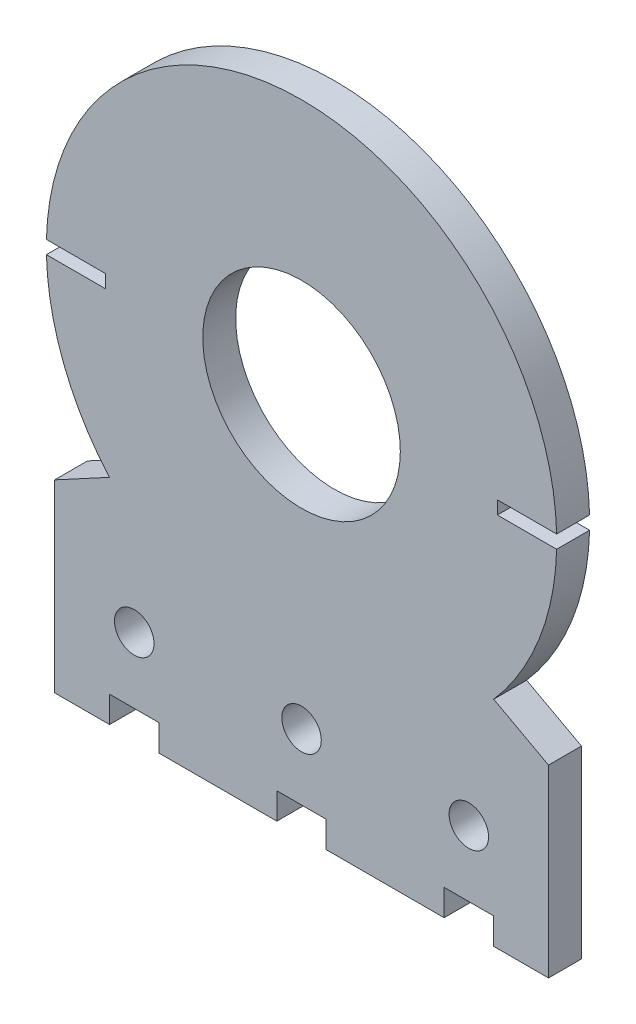
ISO-10303-21;
HEADER;
FILE_DESCRIPTION(('STEP AP214'),'2;1');
FILE_NAME('part.step','',(''),(''),'','','');
FILE_SCHEMA(('AUTOMOTIVE_DESIGN { 1 0 10303 214 1 1 1 1 }'));
ENDSEC;
DATA;
#1=APPLICATION_CONTEXT('core data for automotive mechanical design processes');
#2=APPLICATION_PROTOCOL_DEFINITION('international standard','automotive_design',2000,#1);
#3=PRODUCT_CONTEXT('',#1,'mechanical');
#4=PRODUCT('Part','Part','',(#3));
#5=PRODUCT_RELATED_PRODUCT_CATEGORY('part','',(#4));
#6=PRODUCT_DEFINITION_FORMATION('','',#4);
#7=PRODUCT_DEFINITION_CONTEXT('part definition',#1,'design');
#8=PRODUCT_DEFINITION('design','',#6,#7);
#9=PRODUCT_DEFINITION_SHAPE('','',#8);
#10=(LENGTH_UNIT() NAMED_UNIT(*) SI_UNIT(.MILLI.,.METRE.));
#11=(NAMED_UNIT(*) PLANE_ANGLE_UNIT() SI_UNIT($,.RADIAN.));
#12=(NAMED_UNIT(*) SI_UNIT($,.STERADIAN.) SOLID_ANGLE_UNIT());
#13=UNCERTAINTY_MEASURE_WITH_UNIT(LENGTH_MEASURE(1.E-05),#10,'distance_accuracy_value','');
#14=(GEOMETRIC_REPRESENTATION_CONTEXT(3) GLOBAL_UNCERTAINTY_ASSIGNED_CONTEXT((#13)) GLOBAL_UNIT_ASSIGNED_CONTEXT((#10,
#11,#12)) REPRESENTATION_CONTEXT('',''));
#15=CARTESIAN_POINT('',(0.,0.,0.));
#16=DIRECTION('',(0.,0.,1.));
#17=DIRECTION('',(1.,0.,0.));
#18=AXIS2_PLACEMENT_3D('',#15,#16,#17);
#19=CARTESIAN_POINT('',(0.,0.,0.5));
#20=DIRECTION('',(0.,0.,1.));
#21=DIRECTION('',(1.,0.,0.));
#22=AXIS2_PLACEMENT_3D('',#19,#20,#21);
#23=PLANE('',#22);
#24=CARTESIAN_POINT('',(-5.08,-8.8,0.5));
#25=DIRECTION('',(0.,0.,1.));
#26=DIRECTION('',(1.,0.,0.));
#27=AXIS2_PLACEMENT_3D('',#24,#25,#26);
#28=CIRCLE('',#27,0.6);
#29=CARTESIAN_POINT('',(-4.48,-8.8,0.5));
#30=VERTEX_POINT('',#29);
#31=EDGE_CURVE('E477',#30,#30,#28,.T.);
#32=ORIENTED_EDGE('',*,*,#31,.F.);
#33=EDGE_LOOP('',(#32));
#34=FACE_BOUND('',#33,.T.);
#35=CARTESIAN_POINT('',(0.,-8.8,0.5));
#36=DIRECTION('',(0.,0.,1.));
#37=DIRECTION('',(1.,0.,0.));
#38=AXIS2_PLACEMENT_3D('',#35,#36,#37);
#39=CIRCLE('',#38,0.6);
#40=CARTESIAN_POINT('',(0.6,-8.8,0.5));
#41=VERTEX_POINT('',#40);
#42=EDGE_CURVE('E245',#41,#41,#39,.T.);
#43=ORIENTED_EDGE('',*,*,#42,.F.);
#44=EDGE_LOOP('',(#43));
#45=FACE_BOUND('',#44,.T.);
#46=DIRECTION('',(0.,-1.,0.));
#47=VECTOR('',#46,1.);
#48=CARTESIAN_POINT('',(-7.5,-6.,0.5));
#49=LINE('',#48,#47);
#50=CARTESIAN_POINT('',(-7.5,-6.,0.5));
#51=VERTEX_POINT('',#50);
#52=CARTESIAN_POINT('',(-7.5,-11.6,0.5));
#53=VERTEX_POINT('',#52);
#54=EDGE_CURVE('E294',#51,#53,#49,.T.);
#55=ORIENTED_EDGE('',*,*,#54,.T.);
#56=DIRECTION('',(1.,0.,0.));
#57=VECTOR('',#56,1.);
#58=CARTESIAN_POINT('',(-7.5,-11.6,0.5));
#59=LINE('',#58,#57);
#60=CARTESIAN_POINT('',(-5.83,-11.6,0.5));
#61=VERTEX_POINT('',#60);
#62=EDGE_CURVE('E150',#53,#61,#59,.T.);
#63=ORIENTED_EDGE('',*,*,#62,.T.);
#64=DIRECTION('',(0.,1.,0.));
#65=VECTOR('',#64,1.);
#66=CARTESIAN_POINT('',(-5.83,-11.6,0.5));
#67=LINE('',#66,#65);
#68=CARTESIAN_POINT('',(-5.83,-10.8,0.5));
#69=VERTEX_POINT('',#68);
#70=EDGE_CURVE('E363',#61,#69,#67,.T.);
#71=ORIENTED_EDGE('',*,*,#70,.T.);
#72=DIRECTION('',(1.,0.,0.));
#73=VECTOR('',#72,1.);
#74=CARTESIAN_POINT('',(-5.83,-10.8,0.5));
#75=LINE('',#74,#73);
#76=CARTESIAN_POINT('',(-4.33,-10.8,0.5));
#77=VERTEX_POINT('',#76);
#78=EDGE_CURVE('E382',#69,#77,#75,.T.);
#79=ORIENTED_EDGE('',*,*,#78,.T.);
#80=DIRECTION('',(0.,-1.,0.));
#81=VECTOR('',#80,1.);
#82=CARTESIAN_POINT('',(-4.33,-11.6,0.5));
#83=LINE('',#82,#81);
#84=CARTESIAN_POINT('',(-4.33,-11.6,0.5));
#85=VERTEX_POINT('',#84);
#86=EDGE_CURVE('E379',#77,#85,#83,.T.);
#87=ORIENTED_EDGE('',*,*,#86,.T.);
#88=DIRECTION('',(1.,0.,0.));
#89=VECTOR('',#88,1.);
#90=CARTESIAN_POINT('',(-4.33,-11.6,0.5));
#91=LINE('',#90,#89);
#92=CARTESIAN_POINT('',(-0.75,-11.6,0.5));
#93=VERTEX_POINT('',#92);
#94=EDGE_CURVE('E381',#85,#93,#91,.T.);
#95=ORIENTED_EDGE('',*,*,#94,.T.);
#96=DIRECTION('',(0.,1.,0.));
#97=VECTOR('',#96,1.);
#98=CARTESIAN_POINT('',(-0.75,-11.6,0.5));
#99=LINE('',#98,#97);
#100=CARTESIAN_POINT('',(-0.75,-10.8,0.5));
#101=VERTEX_POINT('',#100);
#102=EDGE_CURVE('E384',#93,#101,#99,.T.);
#103=ORIENTED_EDGE('',*,*,#102,.T.);
#104=DIRECTION('',(1.,0.,0.));
#105=VECTOR('',#104,1.);
#106=CARTESIAN_POINT('',(-0.75,-10.8,0.5));
#107=LINE('',#106,#105);
#108=CARTESIAN_POINT('',(0.75,-10.8,0.5));
#109=VERTEX_POINT('',#108);
#110=EDGE_CURVE('E390',#101,#109,#107,.T.);
#111=ORIENTED_EDGE('',*,*,#110,.T.);
#112=DIRECTION('',(0.,-1.,0.));
#113=VECTOR('',#112,1.);
#114=CARTESIAN_POINT('',(0.75,-11.6,0.5));
#115=LINE('',#114,#113);
#116=CARTESIAN_POINT('',(0.75,-11.6,0.5));
#117=VERTEX_POINT('',#116);
#118=EDGE_CURVE('E392',#109,#117,#115,.T.);
#119=ORIENTED_EDGE('',*,*,#118,.T.);
#120=DIRECTION('',(1.,0.,0.));
#121=VECTOR('',#120,1.);
#122=CARTESIAN_POINT('',(0.75,-11.6,0.5));
#123=LINE('',#122,#121);
#124=CARTESIAN_POINT('',(4.33,-11.6,0.5));
#125=VERTEX_POINT('',#124);
#126=EDGE_CURVE('E394',#117,#125,#123,.T.);
#127=ORIENTED_EDGE('',*,*,#126,.T.);
#128=DIRECTION('',(0.,1.,0.));
#129=VECTOR('',#128,1.);
#130=CARTESIAN_POINT('',(4.33,-11.6,0.5));
#131=LINE('',#130,#129);
#132=CARTESIAN_POINT('',(4.33,-10.8,0.5));
#133=VERTEX_POINT('',#132);
#134=EDGE_CURVE('E396',#125,#133,#131,.T.);
#135=ORIENTED_EDGE('',*,*,#134,.T.);
#136=DIRECTION('',(1.,0.,0.));
#137=VECTOR('',#136,1.);
#138=CARTESIAN_POINT('',(4.33,-10.8,0.5));
#139=LINE('',#138,#137);
#140=CARTESIAN_POINT('',(5.83,-10.8,0.5));
#141=VERTEX_POINT('',#140);
#142=EDGE_CURVE('E398',#133,#141,#139,.T.);
#143=ORIENTED_EDGE('',*,*,#142,.T.);
#144=DIRECTION('',(0.,-1.,0.));
#145=VECTOR('',#144,1.);
#146=CARTESIAN_POINT('',(5.83,-11.6,0.5));
#147=LINE('',#146,#145);
#148=CARTESIAN_POINT('',(5.83,-11.6,0.5));
#149=VERTEX_POINT('',#148);
#150=EDGE_CURVE('E400',#141,#149,#147,.T.);
#151=ORIENTED_EDGE('',*,*,#150,.T.);
#152=DIRECTION('',(1.,0.,0.));
#153=VECTOR('',#152,1.);
#154=CARTESIAN_POINT('',(5.83,-11.6,0.5));
#155=LINE('',#154,#153);
#156=CARTESIAN_POINT('',(7.5,-11.6,0.5));
#157=VERTEX_POINT('',#156);
#158=EDGE_CURVE('E402',#149,#157,#155,.T.);
#159=ORIENTED_EDGE('',*,*,#158,.T.);
#160=DIRECTION('',(0.,1.,0.));
#161=VECTOR('',#160,1.);
#162=CARTESIAN_POINT('',(7.5,-6.,0.5));
#163=LINE('',#162,#161);
#164=CARTESIAN_POINT('',(7.5,-6.,0.5));
#165=VERTEX_POINT('',#164);
#166=EDGE_CURVE('E404',#157,#165,#163,.T.);
#167=ORIENTED_EDGE('',*,*,#166,.T.);
#168=DIRECTION('',(-0.879652496958292,0.475616951542985,0.));
#169=VECTOR('',#168,1.);
#170=CARTESIAN_POINT('',(7.5,-6.,0.5));
#171=LINE('',#170,#169);
#172=CARTESIAN_POINT('',(5.83545199620389,-5.1,0.5));
#173=VERTEX_POINT('',#172);
#174=EDGE_CURVE('E406',#165,#173,#171,.T.);
#175=ORIENTED_EDGE('',*,*,#174,.T.);
#176=CARTESIAN_POINT('',(0.,0.,0.5));
#177=DIRECTION('',(0.,0.,1.));
#178=DIRECTION('',(1.,0.,0.));
#179=AXIS2_PLACEMENT_3D('',#176,#177,#178);
#180=CIRCLE('',#179,7.75);
#181=CARTESIAN_POINT('',(7.74741892503561,-0.200000000000004,0.5));
#182=VERTEX_POINT('',#181);
#183=EDGE_CURVE('E408',#173,#182,#180,.T.);
#184=ORIENTED_EDGE('',*,*,#183,.T.);
#185=DIRECTION('',(-1.,0.,0.));
#186=VECTOR('',#185,1.);
#187=CARTESIAN_POINT('',(5.94741892503562,-0.200000000000004,0.5));
#188=LINE('',#187,#186);
#189=CARTESIAN_POINT('',(5.94741892503562,-0.200000000000004,0.5));
#190=VERTEX_POINT('',#189);
#191=EDGE_CURVE('E410',#182,#190,#188,.T.);
#192=ORIENTED_EDGE('',*,*,#191,.T.);
#193=DIRECTION('',(0.,1.,0.));
#194=VECTOR('',#193,1.);
#195=CARTESIAN_POINT('',(5.94741892503562,0.,0.5));
#196=LINE('',#195,#194);
#197=CARTESIAN_POINT('',(5.94741892503562,0.2,0.5));
#198=VERTEX_POINT('',#197);
#199=EDGE_CURVE('E412',#190,#198,#196,.T.);
#200=ORIENTED_EDGE('',*,*,#199,.T.);
#201=DIRECTION('',(1.,0.,0.));
#202=VECTOR('',#201,1.);
#203=CARTESIAN_POINT('',(5.94741892503562,0.2,0.5));
#204=LINE('',#203,#202);
#205=CARTESIAN_POINT('',(7.74741892503561,0.2,0.5));
#206=VERTEX_POINT('',#205);
#207=EDGE_CURVE('E414',#198,#206,#204,.T.);
#208=ORIENTED_EDGE('',*,*,#207,.T.);
#209=CARTESIAN_POINT('',(0.,0.,0.5));
#210=DIRECTION('',(0.,0.,1.));
#211=DIRECTION('',(1.,0.,0.));
#212=AXIS2_PLACEMENT_3D('',#209,#210,#211);
#213=CIRCLE('',#212,7.75);
#214=CARTESIAN_POINT('',(-7.74741892503561,0.2,0.5));
#215=VERTEX_POINT('',#214);
#216=EDGE_CURVE('E416',#206,#215,#213,.T.);
#217=ORIENTED_EDGE('',*,*,#216,.T.);
#218=DIRECTION('',(1.,0.,0.));
#219=VECTOR('',#218,1.);
#220=CARTESIAN_POINT('',(-5.94741892503562,0.2,0.5));
#221=LINE('',#220,#219);
#222=CARTESIAN_POINT('',(-5.94741892503562,0.2,0.5));
#223=VERTEX_POINT('',#222);
#224=EDGE_CURVE('E418',#215,#223,#221,.T.);
#225=ORIENTED_EDGE('',*,*,#224,.T.);
#226=DIRECTION('',(0.,-1.,0.));
#227=VECTOR('',#226,1.);
#228=CARTESIAN_POINT('',(-5.94741892503562,0.,0.5));
#229=LINE('',#228,#227);
#230=CARTESIAN_POINT('',(-5.94741892503562,-0.200000000000004,0.5));
#231=VERTEX_POINT('',#230);
#232=EDGE_CURVE('E223',#223,#231,#229,.T.);
#233=ORIENTED_EDGE('',*,*,#232,.T.);
#234=DIRECTION('',(-1.,0.,0.));
#235=VECTOR('',#234,1.);
#236=CARTESIAN_POINT('',(-5.94741892503562,-0.200000000000004,0.5));
#237=LINE('',#236,#235);
#238=CARTESIAN_POINT('',(-7.74741892503561,-0.200000000000004,0.5));
#239=VERTEX_POINT('',#238);
#240=EDGE_CURVE('E217',#231,#239,#237,.T.);
#241=ORIENTED_EDGE('',*,*,#240,.T.);
#242=CARTESIAN_POINT('',(0.,0.,0.5));
#243=DIRECTION('',(0.,0.,1.));
#244=DIRECTION('',(1.,0.,0.));
#245=AXIS2_PLACEMENT_3D('',#242,#243,#244);
#246=CIRCLE('',#245,7.75);
#247=CARTESIAN_POINT('',(-5.83545199620389,-5.1,0.5));
#248=VERTEX_POINT('',#247);
#249=EDGE_CURVE('E221',#239,#248,#246,.T.);
#250=ORIENTED_EDGE('',*,*,#249,.T.);
#251=DIRECTION('',(-0.879652496958292,-0.475616951542985,0.));
#252=VECTOR('',#251,1.);
#253=CARTESIAN_POINT('',(-7.5,-6.,0.5));
#254=LINE('',#253,#252);
#255=EDGE_CURVE('E53',#248,#51,#254,.T.);
#256=ORIENTED_EDGE('',*,*,#255,.T.);
#257=EDGE_LOOP('',(#55,#63,#71,#79,#87,#95,#103,#111,#119,#127,#135,#143,#151,#159,#167,#175,
#184,#192,#200,#208,#217,#225,#233,#241,#250,#256));
#258=FACE_BOUND('',#257,.T.);
#259=CARTESIAN_POINT('',(5.08,-8.8,0.5));
#260=DIRECTION('',(0.,0.,1.));
#261=DIRECTION('',(1.,0.,0.));
#262=AXIS2_PLACEMENT_3D('',#259,#260,#261);
#263=CIRCLE('',#262,0.6);
#264=CARTESIAN_POINT('',(5.68,-8.8,0.5));
#265=VERTEX_POINT('',#264);
#266=EDGE_CURVE('E483',#265,#265,#263,.T.);
#267=ORIENTED_EDGE('',*,*,#266,.F.);
#268=EDGE_LOOP('',(#267));
#269=FACE_BOUND('',#268,.T.);
#270=CARTESIAN_POINT('',(0.,0.,0.5));
#271=DIRECTION('',(0.,0.,1.));
#272=DIRECTION('',(1.,0.,0.));
#273=AXIS2_PLACEMENT_3D('',#270,#271,#272);
#274=CIRCLE('',#273,3.);
#275=CARTESIAN_POINT('',(3.,0.,0.5));
#276=VERTEX_POINT('',#275);
#277=EDGE_CURVE('E468',#276,#276,#274,.T.);
#278=ORIENTED_EDGE('',*,*,#277,.F.);
#279=EDGE_LOOP('',(#278));
#280=FACE_BOUND('',#279,.T.);
#281=ADVANCED_FACE('F36',(#34,#45,#258,#269,#280),#23,.T.);
#282=CARTESIAN_POINT('',(0.,0.,-0.5));
#283=DIRECTION('',(0.,0.,1.));
#284=DIRECTION('',(1.,0.,0.));
#285=AXIS2_PLACEMENT_3D('',#282,#283,#284);
#286=PLANE('',#285);
#287=DIRECTION('',(0.,-1.,0.));
#288=VECTOR('',#287,1.);
#289=CARTESIAN_POINT('',(-7.5,-6.,-0.5));
#290=LINE('',#289,#288);
#291=CARTESIAN_POINT('',(-7.5,-6.,-0.5));
#292=VERTEX_POINT('',#291);
#293=CARTESIAN_POINT('',(-7.5,-11.6,-0.5));
#294=VERTEX_POINT('',#293);
#295=EDGE_CURVE('E241',#292,#294,#290,.T.);
#296=ORIENTED_EDGE('',*,*,#295,.F.);
#297=DIRECTION('',(-0.879652496958292,-0.475616951542985,0.));
#298=VECTOR('',#297,1.);
#299=CARTESIAN_POINT('',(-7.5,-6.,-0.5));
#300=LINE('',#299,#298);
#301=CARTESIAN_POINT('',(-5.83545199620389,-5.1,-0.5));
#302=VERTEX_POINT('',#301);
#303=EDGE_CURVE('E142',#302,#292,#300,.T.);
#304=ORIENTED_EDGE('',*,*,#303,.F.);
#305=CARTESIAN_POINT('',(0.,0.,-0.5));
#306=DIRECTION('',(0.,0.,1.));
#307=DIRECTION('',(1.,0.,0.));
#308=AXIS2_PLACEMENT_3D('',#305,#306,#307);
#309=CIRCLE('',#308,7.75);
#310=CARTESIAN_POINT('',(-7.74741892503561,-0.200000000000004,-0.5));
#311=VERTEX_POINT('',#310);
#312=EDGE_CURVE('E136',#311,#302,#309,.T.);
#313=ORIENTED_EDGE('',*,*,#312,.F.);
#314=DIRECTION('',(-1.,0.,0.));
#315=VECTOR('',#314,1.);
#316=CARTESIAN_POINT('',(-5.94741892503562,-0.200000000000004,-0.5));
#317=LINE('',#316,#315);
#318=CARTESIAN_POINT('',(-5.94741892503562,-0.200000000000004,-0.5));
#319=VERTEX_POINT('',#318);
#320=EDGE_CURVE('E231',#319,#311,#317,.T.);
#321=ORIENTED_EDGE('',*,*,#320,.F.);
#322=DIRECTION('',(0.,-1.,0.));
#323=VECTOR('',#322,1.);
#324=CARTESIAN_POINT('',(-5.94741892503562,0.,-0.5));
#325=LINE('',#324,#323);
#326=CARTESIAN_POINT('',(-5.94741892503562,0.2,-0.5));
#327=VERTEX_POINT('',#326);
#328=EDGE_CURVE('E289',#327,#319,#325,.T.);
#329=ORIENTED_EDGE('',*,*,#328,.F.);
#330=DIRECTION('',(1.,0.,0.));
#331=VECTOR('',#330,1.);
#332=CARTESIAN_POINT('',(-5.94741892503562,0.2,-0.5));
#333=LINE('',#332,#331);
#334=CARTESIAN_POINT('',(-7.74741892503561,0.2,-0.5));
#335=VERTEX_POINT('',#334);
#336=EDGE_CURVE('E286',#335,#327,#333,.T.);
#337=ORIENTED_EDGE('',*,*,#336,.F.);
#338=CARTESIAN_POINT('',(0.,0.,-0.5));
#339=DIRECTION('',(0.,0.,1.));
#340=DIRECTION('',(1.,0.,0.));
#341=AXIS2_PLACEMENT_3D('',#338,#339,#340);
#342=CIRCLE('',#341,7.75);
#343=CARTESIAN_POINT('',(7.74741892503561,0.2,-0.5));
#344=VERTEX_POINT('',#343);
#345=EDGE_CURVE('E284',#344,#335,#342,.T.);
#346=ORIENTED_EDGE('',*,*,#345,.F.);
#347=DIRECTION('',(1.,0.,0.));
#348=VECTOR('',#347,1.);
#349=CARTESIAN_POINT('',(5.94741892503562,0.2,-0.5));
#350=LINE('',#349,#348);
#351=CARTESIAN_POINT('',(5.94741892503562,0.2,-0.5));
#352=VERTEX_POINT('',#351);
#353=EDGE_CURVE('E282',#352,#344,#350,.T.);
#354=ORIENTED_EDGE('',*,*,#353,.F.);
#355=DIRECTION('',(0.,1.,0.));
#356=VECTOR('',#355,1.);
#357=CARTESIAN_POINT('',(5.94741892503562,0.,-0.5));
#358=LINE('',#357,#356);
#359=CARTESIAN_POINT('',(5.94741892503562,-0.200000000000004,-0.5));
#360=VERTEX_POINT('',#359);
#361=EDGE_CURVE('E280',#360,#352,#358,.T.);
#362=ORIENTED_EDGE('',*,*,#361,.F.);
#363=DIRECTION('',(-1.,0.,0.));
#364=VECTOR('',#363,1.);
#365=CARTESIAN_POINT('',(5.94741892503562,-0.200000000000004,-0.5));
#366=LINE('',#365,#364);
#367=CARTESIAN_POINT('',(7.74741892503561,-0.200000000000004,-0.5));
#368=VERTEX_POINT('',#367);
#369=EDGE_CURVE('E277',#368,#360,#366,.T.);
#370=ORIENTED_EDGE('',*,*,#369,.F.);
#371=CARTESIAN_POINT('',(0.,0.,-0.5));
#372=DIRECTION('',(0.,0.,1.));
#373=DIRECTION('',(1.,0.,0.));
#374=AXIS2_PLACEMENT_3D('',#371,#372,#373);
#375=CIRCLE('',#374,7.75);
#376=CARTESIAN_POINT('',(5.83545199620389,-5.1,-0.5));
#377=VERTEX_POINT('',#376);
#378=EDGE_CURVE('E275',#377,#368,#375,.T.);
#379=ORIENTED_EDGE('',*,*,#378,.F.);
#380=DIRECTION('',(-0.879652496958292,0.475616951542985,0.));
#381=VECTOR('',#380,1.);
#382=CARTESIAN_POINT('',(7.5,-6.,-0.5));
#383=LINE('',#382,#381);
#384=CARTESIAN_POINT('',(7.5,-6.,-0.5));
#385=VERTEX_POINT('',#384);
#386=EDGE_CURVE('E273',#385,#377,#383,.T.);
#387=ORIENTED_EDGE('',*,*,#386,.F.);
#388=DIRECTION('',(0.,1.,0.));
#389=VECTOR('',#388,1.);
#390=CARTESIAN_POINT('',(7.5,-6.,-0.5));
#391=LINE('',#390,#389);
#392=CARTESIAN_POINT('',(7.5,-11.6,-0.5));
#393=VERTEX_POINT('',#392);
#394=EDGE_CURVE('E271',#393,#385,#391,.T.);
#395=ORIENTED_EDGE('',*,*,#394,.F.);
#396=DIRECTION('',(1.,0.,0.));
#397=VECTOR('',#396,1.);
#398=CARTESIAN_POINT('',(5.83,-11.6,-0.5));
#399=LINE('',#398,#397);
#400=CARTESIAN_POINT('',(5.83,-11.6,-0.5));
#401=VERTEX_POINT('',#400);
#402=EDGE_CURVE('E269',#401,#393,#399,.T.);
#403=ORIENTED_EDGE('',*,*,#402,.F.);
#404=DIRECTION('',(0.,-1.,0.));
#405=VECTOR('',#404,1.);
#406=CARTESIAN_POINT('',(5.83,-11.6,-0.5));
#407=LINE('',#406,#405);
#408=CARTESIAN_POINT('',(5.83,-10.8,-0.5));
#409=VERTEX_POINT('',#408);
#410=EDGE_CURVE('E267',#409,#401,#407,.T.);
#411=ORIENTED_EDGE('',*,*,#410,.F.);
#412=DIRECTION('',(1.,0.,0.));
#413=VECTOR('',#412,1.);
#414=CARTESIAN_POINT('',(4.33,-10.8,-0.5));
#415=LINE('',#414,#413);
#416=CARTESIAN_POINT('',(4.33,-10.8,-0.5));
#417=VERTEX_POINT('',#416);
#418=EDGE_CURVE('E265',#417,#409,#415,.T.);
#419=ORIENTED_EDGE('',*,*,#418,.F.);
#420=DIRECTION('',(0.,1.,0.));
#421=VECTOR('',#420,1.);
#422=CARTESIAN_POINT('',(4.33,-11.6,-0.5));
#423=LINE('',#422,#421);
#424=CARTESIAN_POINT('',(4.33,-11.6,-0.5));
#425=VERTEX_POINT('',#424);
#426=EDGE_CURVE('E263',#425,#417,#423,.T.);
#427=ORIENTED_EDGE('',*,*,#426,.F.);
#428=DIRECTION('',(1.,0.,0.));
#429=VECTOR('',#428,1.);
#430=CARTESIAN_POINT('',(0.75,-11.6,-0.5));
#431=LINE('',#430,#429);
#432=CARTESIAN_POINT('',(0.75,-11.6,-0.5));
#433=VERTEX_POINT('',#432);
#434=EDGE_CURVE('E261',#433,#425,#431,.T.);
#435=ORIENTED_EDGE('',*,*,#434,.F.);
#436=DIRECTION('',(0.,-1.,0.));
#437=VECTOR('',#436,1.);
#438=CARTESIAN_POINT('',(0.75,-11.6,-0.5));
#439=LINE('',#438,#437);
#440=CARTESIAN_POINT('',(0.75,-10.8,-0.5));
#441=VERTEX_POINT('',#440);
#442=EDGE_CURVE('E259',#441,#433,#439,.T.);
#443=ORIENTED_EDGE('',*,*,#442,.F.);
#444=DIRECTION('',(1.,0.,0.));
#445=VECTOR('',#444,1.);
#446=CARTESIAN_POINT('',(-0.75,-10.8,-0.5));
#447=LINE('',#446,#445);
#448=CARTESIAN_POINT('',(-0.75,-10.8,-0.5));
#449=VERTEX_POINT('',#448);
#450=EDGE_CURVE('E257',#449,#441,#447,.T.);
#451=ORIENTED_EDGE('',*,*,#450,.F.);
#452=DIRECTION('',(0.,1.,0.));
#453=VECTOR('',#452,1.);
#454=CARTESIAN_POINT('',(-0.75,-11.6,-0.5));
#455=LINE('',#454,#453);
#456=CARTESIAN_POINT('',(-0.75,-11.6,-0.5));
#457=VERTEX_POINT('',#456);
#458=EDGE_CURVE('E255',#457,#449,#455,.T.);
#459=ORIENTED_EDGE('',*,*,#458,.F.);
#460=DIRECTION('',(1.,0.,0.));
#461=VECTOR('',#460,1.);
#462=CARTESIAN_POINT('',(-4.33,-11.6,-0.5));
#463=LINE('',#462,#461);
#464=CARTESIAN_POINT('',(-4.33,-11.6,-0.5));
#465=VERTEX_POINT('',#464);
#466=EDGE_CURVE('E253',#465,#457,#463,.T.);
#467=ORIENTED_EDGE('',*,*,#466,.F.);
#468=DIRECTION('',(0.,-1.,0.));
#469=VECTOR('',#468,1.);
#470=CARTESIAN_POINT('',(-4.33,-11.6,-0.5));
#471=LINE('',#470,#469);
#472=CARTESIAN_POINT('',(-4.33,-10.8,-0.5));
#473=VERTEX_POINT('',#472);
#474=EDGE_CURVE('E251',#473,#465,#471,.T.);
#475=ORIENTED_EDGE('',*,*,#474,.F.);
#476=DIRECTION('',(1.,0.,0.));
#477=VECTOR('',#476,1.);
#478=CARTESIAN_POINT('',(-5.83,-10.8,-0.5));
#479=LINE('',#478,#477);
#480=CARTESIAN_POINT('',(-5.83,-10.8,-0.5));
#481=VERTEX_POINT('',#480);
#482=EDGE_CURVE('E249',#481,#473,#479,.T.);
#483=ORIENTED_EDGE('',*,*,#482,.F.);
#484=DIRECTION('',(0.,1.,0.));
#485=VECTOR('',#484,1.);
#486=CARTESIAN_POINT('',(-5.83,-11.6,-0.5));
#487=LINE('',#486,#485);
#488=CARTESIAN_POINT('',(-5.83,-11.6,-0.5));
#489=VERTEX_POINT('',#488);
#490=EDGE_CURVE('E247',#489,#481,#487,.T.);
#491=ORIENTED_EDGE('',*,*,#490,.F.);
#492=DIRECTION('',(1.,0.,0.));
#493=VECTOR('',#492,1.);
#494=CARTESIAN_POINT('',(-7.5,-11.6,-0.5));
#495=LINE('',#494,#493);
#496=EDGE_CURVE('E244',#294,#489,#495,.T.);
#497=ORIENTED_EDGE('',*,*,#496,.F.);
#498=EDGE_LOOP('',(#296,#304,#313,#321,#329,#337,#346,#354,#362,#370,#379,#387,#395,#403,#411,
#419,#427,#435,#443,#451,#459,#467,#475,#483,#491,#497));
#499=FACE_BOUND('',#498,.T.);
#500=CARTESIAN_POINT('',(0.,-8.8,-0.5));
#501=DIRECTION('',(0.,0.,1.));
#502=DIRECTION('',(1.,0.,0.));
#503=AXIS2_PLACEMENT_3D('',#500,#501,#502);
#504=CIRCLE('',#503,0.6);
#505=CARTESIAN_POINT('',(0.6,-8.8,-0.5));
#506=VERTEX_POINT('',#505);
#507=EDGE_CURVE('E486',#506,#506,#504,.T.);
#508=ORIENTED_EDGE('',*,*,#507,.T.);
#509=EDGE_LOOP('',(#508));
#510=FACE_BOUND('',#509,.T.);
#511=CARTESIAN_POINT('',(5.08,-8.8,-0.5));
#512=DIRECTION('',(0.,0.,1.));
#513=DIRECTION('',(1.,0.,0.));
#514=AXIS2_PLACEMENT_3D('',#511,#512,#513);
#515=CIRCLE('',#514,0.6);
#516=CARTESIAN_POINT('',(5.68,-8.8,-0.5));
#517=VERTEX_POINT('',#516);
#518=EDGE_CURVE('E480',#517,#517,#515,.T.);
#519=ORIENTED_EDGE('',*,*,#518,.T.);
#520=EDGE_LOOP('',(#519));
#521=FACE_BOUND('',#520,.T.);
#522=CARTESIAN_POINT('',(-5.08,-8.8,-0.5));
#523=DIRECTION('',(0.,0.,1.));
#524=DIRECTION('',(1.,0.,0.));
#525=AXIS2_PLACEMENT_3D('',#522,#523,#524);
#526=CIRCLE('',#525,0.6);
#527=CARTESIAN_POINT('',(-4.48,-8.8,-0.5));
#528=VERTEX_POINT('',#527);
#529=EDGE_CURVE('E474',#528,#528,#526,.T.);
#530=ORIENTED_EDGE('',*,*,#529,.T.);
#531=EDGE_LOOP('',(#530));
#532=FACE_BOUND('',#531,.T.);
#533=CARTESIAN_POINT('',(0.,0.,-0.5));
#534=DIRECTION('',(0.,0.,1.));
#535=DIRECTION('',(1.,0.,0.));
#536=AXIS2_PLACEMENT_3D('',#533,#534,#535);
#537=CIRCLE('',#536,3.);
#538=CARTESIAN_POINT('',(3.,0.,-0.5));
#539=VERTEX_POINT('',#538);
#540=EDGE_CURVE('E471',#539,#539,#537,.T.);
#541=ORIENTED_EDGE('',*,*,#540,.T.);
#542=EDGE_LOOP('',(#541));
#543=FACE_BOUND('',#542,.T.);
#544=ADVANCED_FACE('F367',(#499,#510,#521,#532,#543),#286,.F.);
#545=CARTESIAN_POINT('',(-7.5,-6.,0.5));
#546=DIRECTION('',(1.,0.,0.));
#547=DIRECTION('',(0.,0.,-1.));
#548=AXIS2_PLACEMENT_3D('',#545,#546,#547);
#549=PLANE('',#548);
#550=ORIENTED_EDGE('',*,*,#295,.T.);
#551=DIRECTION('',(0.,0.,-1.));
#552=VECTOR('',#551,1.);
#553=CARTESIAN_POINT('',(-7.5,-11.6,0.5));
#554=LINE('',#553,#552);
#555=EDGE_CURVE('E11',#53,#294,#554,.T.);
#556=ORIENTED_EDGE('',*,*,#555,.F.);
#557=ORIENTED_EDGE('',*,*,#54,.F.);
#558=DIRECTION('',(0.,0.,-1.));
#559=VECTOR('',#558,1.);
#560=CARTESIAN_POINT('',(-7.5,-6.,0.5));
#561=LINE('',#560,#559);
#562=EDGE_CURVE('E237',#51,#292,#561,.T.);
#563=ORIENTED_EDGE('',*,*,#562,.T.);
#564=EDGE_LOOP('',(#550,#556,#557,#563));
#565=FACE_BOUND('',#564,.T.);
#566=ADVANCED_FACE('F38',(#565),#549,.F.);
#567=CARTESIAN_POINT('',(-7.5,-11.6,0.5));
#568=DIRECTION('',(0.,1.,0.));
#569=DIRECTION('',(0.,0.,1.));
#570=AXIS2_PLACEMENT_3D('',#567,#568,#569);
#571=PLANE('',#570);
#572=ORIENTED_EDGE('',*,*,#496,.T.);
#573=DIRECTION('',(0.,0.,-1.));
#574=VECTOR('',#573,1.);
#575=CARTESIAN_POINT('',(-5.83,-11.6,0.5));
#576=LINE('',#575,#574);
#577=EDGE_CURVE('E45',#61,#489,#576,.T.);
#578=ORIENTED_EDGE('',*,*,#577,.F.);
#579=ORIENTED_EDGE('',*,*,#62,.F.);
#580=ORIENTED_EDGE('',*,*,#555,.T.);
#581=EDGE_LOOP('',(#572,#578,#579,#580));
#582=FACE_BOUND('',#581,.T.);
#583=ADVANCED_FACE('F738',(#582),#571,.F.);
#584=CARTESIAN_POINT('',(-5.83,-11.6,0.5));
#585=DIRECTION('',(-1.,0.,0.));
#586=DIRECTION('',(0.,0.,1.));
#587=AXIS2_PLACEMENT_3D('',#584,#585,#586);
#588=PLANE('',#587);
#589=ORIENTED_EDGE('',*,*,#490,.T.);
#590=DIRECTION('',(0.,0.,-1.));
#591=VECTOR('',#590,1.);
#592=CARTESIAN_POINT('',(-5.83,-10.8,0.5));
#593=LINE('',#592,#591);
#594=EDGE_CURVE('E355',#69,#481,#593,.T.);
#595=ORIENTED_EDGE('',*,*,#594,.F.);
#596=ORIENTED_EDGE('',*,*,#70,.F.);
#597=ORIENTED_EDGE('',*,*,#577,.T.);
#598=EDGE_LOOP('',(#589,#595,#596,#597));
#599=FACE_BOUND('',#598,.T.);
#600=ADVANCED_FACE('F361',(#599),#588,.F.);
#601=CARTESIAN_POINT('',(-5.83,-10.8,0.5));
#602=DIRECTION('',(0.,1.,0.));
#603=DIRECTION('',(0.,0.,1.));
#604=AXIS2_PLACEMENT_3D('',#601,#602,#603);
#605=PLANE('',#604);
#606=ORIENTED_EDGE('',*,*,#482,.T.);
#607=DIRECTION('',(0.,0.,-1.));
#608=VECTOR('',#607,1.);
#609=CARTESIAN_POINT('',(-4.33,-10.8,0.5));
#610=LINE('',#609,#608);
#611=EDGE_CURVE('E352',#77,#473,#610,.T.);
#612=ORIENTED_EDGE('',*,*,#611,.F.);
#613=ORIENTED_EDGE('',*,*,#78,.F.);
#614=ORIENTED_EDGE('',*,*,#594,.T.);
#615=EDGE_LOOP('',(#606,#612,#613,#614));
#616=FACE_BOUND('',#615,.T.);
#617=ADVANCED_FACE('F373',(#616),#605,.F.);
#618=CARTESIAN_POINT('',(-4.33,-11.6,0.5));
#619=DIRECTION('',(1.,0.,0.));
#620=DIRECTION('',(0.,0.,-1.));
#621=AXIS2_PLACEMENT_3D('',#618,#619,#620);
#622=PLANE('',#621);
#623=ORIENTED_EDGE('',*,*,#474,.T.);
#624=DIRECTION('',(0.,0.,-1.));
#625=VECTOR('',#624,1.);
#626=CARTESIAN_POINT('',(-4.33,-11.6,0.5));
#627=LINE('',#626,#625);
#628=EDGE_CURVE('E349',#85,#465,#627,.T.);
#629=ORIENTED_EDGE('',*,*,#628,.F.);
#630=ORIENTED_EDGE('',*,*,#86,.F.);
#631=ORIENTED_EDGE('',*,*,#611,.T.);
#632=EDGE_LOOP('',(#623,#629,#630,#631));
#633=FACE_BOUND('',#632,.T.);
#634=ADVANCED_FACE('F377',(#633),#622,.F.);
#635=CARTESIAN_POINT('',(-4.33,-11.6,0.5));
#636=DIRECTION('',(0.,1.,0.));
#637=DIRECTION('',(0.,0.,1.));
#638=AXIS2_PLACEMENT_3D('',#635,#636,#637);
#639=PLANE('',#638);
#640=ORIENTED_EDGE('',*,*,#466,.T.);
#641=DIRECTION('',(0.,0.,-1.));
#642=VECTOR('',#641,1.);
#643=CARTESIAN_POINT('',(-0.75,-11.6,0.5));
#644=LINE('',#643,#642);
#645=EDGE_CURVE('E346',#93,#457,#644,.T.);
#646=ORIENTED_EDGE('',*,*,#645,.F.);
#647=ORIENTED_EDGE('',*,*,#94,.F.);
#648=ORIENTED_EDGE('',*,*,#628,.T.);
#649=EDGE_LOOP('',(#640,#646,#647,#648));
#650=FACE_BOUND('',#649,.T.);
#651=ADVANCED_FACE('F703',(#650),#639,.F.);
#652=CARTESIAN_POINT('',(-0.75,-11.6,0.5));
#653=DIRECTION('',(-1.,0.,0.));
#654=DIRECTION('',(0.,0.,1.));
#655=AXIS2_PLACEMENT_3D('',#652,#653,#654);
#656=PLANE('',#655);
#657=ORIENTED_EDGE('',*,*,#458,.T.);
#658=DIRECTION('',(0.,0.,-1.));
#659=VECTOR('',#658,1.);
#660=CARTESIAN_POINT('',(-0.75,-10.8,0.5));
#661=LINE('',#660,#659);
#662=EDGE_CURVE('E343',#101,#449,#661,.T.);
#663=ORIENTED_EDGE('',*,*,#662,.F.);
#664=ORIENTED_EDGE('',*,*,#102,.F.);
#665=ORIENTED_EDGE('',*,*,#645,.T.);
#666=EDGE_LOOP('',(#657,#663,#664,#665));
#667=FACE_BOUND('',#666,.T.);
#668=ADVANCED_FACE('F693',(#667),#656,.F.);
#669=CARTESIAN_POINT('',(-0.75,-10.8,0.5));
#670=DIRECTION('',(0.,1.,0.));
#671=DIRECTION('',(0.,0.,1.));
#672=AXIS2_PLACEMENT_3D('',#669,#670,#671);
#673=PLANE('',#672);
#674=ORIENTED_EDGE('',*,*,#450,.T.);
#675=DIRECTION('',(0.,0.,-1.));
#676=VECTOR('',#675,1.);
#677=CARTESIAN_POINT('',(0.75,-10.8,0.5));
#678=LINE('',#677,#676);
#679=EDGE_CURVE('E340',#109,#441,#678,.T.);
#680=ORIENTED_EDGE('',*,*,#679,.F.);
#681=ORIENTED_EDGE('',*,*,#110,.F.);
#682=ORIENTED_EDGE('',*,*,#662,.T.);
#683=EDGE_LOOP('',(#674,#680,#681,#682));
#684=FACE_BOUND('',#683,.T.);
#685=ADVANCED_FACE('F683',(#684),#673,.F.);
#686=CARTESIAN_POINT('',(0.75,-11.6,0.5));
#687=DIRECTION('',(1.,0.,0.));
#688=DIRECTION('',(0.,0.,-1.));
#689=AXIS2_PLACEMENT_3D('',#686,#687,#688);
#690=PLANE('',#689);
#691=ORIENTED_EDGE('',*,*,#442,.T.);
#692=DIRECTION('',(0.,0.,-1.));
#693=VECTOR('',#692,1.);
#694=CARTESIAN_POINT('',(0.75,-11.6,0.5));
#695=LINE('',#694,#693);
#696=EDGE_CURVE('E337',#117,#433,#695,.T.);
#697=ORIENTED_EDGE('',*,*,#696,.F.);
#698=ORIENTED_EDGE('',*,*,#118,.F.);
#699=ORIENTED_EDGE('',*,*,#679,.T.);
#700=EDGE_LOOP('',(#691,#697,#698,#699));
#701=FACE_BOUND('',#700,.T.);
#702=ADVANCED_FACE('F673',(#701),#690,.F.);
#703=CARTESIAN_POINT('',(0.75,-11.6,0.5));
#704=DIRECTION('',(0.,1.,0.));
#705=DIRECTION('',(0.,0.,1.));
#706=AXIS2_PLACEMENT_3D('',#703,#704,#705);
#707=PLANE('',#706);
#708=ORIENTED_EDGE('',*,*,#434,.T.);
#709=DIRECTION('',(0.,0.,-1.));
#710=VECTOR('',#709,1.);
#711=CARTESIAN_POINT('',(4.33,-11.6,0.5));
#712=LINE('',#711,#710);
#713=EDGE_CURVE('E334',#125,#425,#712,.T.);
#714=ORIENTED_EDGE('',*,*,#713,.F.);
#715=ORIENTED_EDGE('',*,*,#126,.F.);
#716=ORIENTED_EDGE('',*,*,#696,.T.);
#717=EDGE_LOOP('',(#708,#714,#715,#716));
#718=FACE_BOUND('',#717,.T.);
#719=ADVANCED_FACE('F663',(#718),#707,.F.);
#720=CARTESIAN_POINT('',(4.33,-11.6,0.5));
#721=DIRECTION('',(-1.,0.,0.));
#722=DIRECTION('',(0.,0.,1.));
#723=AXIS2_PLACEMENT_3D('',#720,#721,#722);
#724=PLANE('',#723);
#725=ORIENTED_EDGE('',*,*,#426,.T.);
#726=DIRECTION('',(0.,0.,-1.));
#727=VECTOR('',#726,1.);
#728=CARTESIAN_POINT('',(4.33,-10.8,0.5));
#729=LINE('',#728,#727);
#730=EDGE_CURVE('E331',#133,#417,#729,.T.);
#731=ORIENTED_EDGE('',*,*,#730,.F.);
#732=ORIENTED_EDGE('',*,*,#134,.F.);
#733=ORIENTED_EDGE('',*,*,#713,.T.);
#734=EDGE_LOOP('',(#725,#731,#732,#733));
#735=FACE_BOUND('',#734,.T.);
#736=ADVANCED_FACE('F653',(#735),#724,.F.);
#737=CARTESIAN_POINT('',(4.33,-10.8,0.5));
#738=DIRECTION('',(0.,1.,0.));
#739=DIRECTION('',(0.,0.,1.));
#740=AXIS2_PLACEMENT_3D('',#737,#738,#739);
#741=PLANE('',#740);
#742=ORIENTED_EDGE('',*,*,#418,.T.);
#743=DIRECTION('',(0.,0.,-1.));
#744=VECTOR('',#743,1.);
#745=CARTESIAN_POINT('',(5.83,-10.8,0.5));
#746=LINE('',#745,#744);
#747=EDGE_CURVE('E328',#141,#409,#746,.T.);
#748=ORIENTED_EDGE('',*,*,#747,.F.);
#749=ORIENTED_EDGE('',*,*,#142,.F.);
#750=ORIENTED_EDGE('',*,*,#730,.T.);
#751=EDGE_LOOP('',(#742,#748,#749,#750));
#752=FACE_BOUND('',#751,.T.);
#753=ADVANCED_FACE('F643',(#752),#741,.F.);
#754=CARTESIAN_POINT('',(5.83,-11.6,0.5));
#755=DIRECTION('',(1.,0.,0.));
#756=DIRECTION('',(0.,0.,-1.));
#757=AXIS2_PLACEMENT_3D('',#754,#755,#756);
#758=PLANE('',#757);
#759=ORIENTED_EDGE('',*,*,#410,.T.);
#760=DIRECTION('',(0.,0.,-1.));
#761=VECTOR('',#760,1.);
#762=CARTESIAN_POINT('',(5.83,-11.6,0.5));
#763=LINE('',#762,#761);
#764=EDGE_CURVE('E325',#149,#401,#763,.T.);
#765=ORIENTED_EDGE('',*,*,#764,.F.);
#766=ORIENTED_EDGE('',*,*,#150,.F.);
#767=ORIENTED_EDGE('',*,*,#747,.T.);
#768=EDGE_LOOP('',(#759,#765,#766,#767));
#769=FACE_BOUND('',#768,.T.);
#770=ADVANCED_FACE('F633',(#769),#758,.F.);
#771=CARTESIAN_POINT('',(5.83,-11.6,0.5));
#772=DIRECTION('',(0.,1.,0.));
#773=DIRECTION('',(0.,0.,1.));
#774=AXIS2_PLACEMENT_3D('',#771,#772,#773);
#775=PLANE('',#774);
#776=ORIENTED_EDGE('',*,*,#402,.T.);
#777=DIRECTION('',(0.,0.,-1.));
#778=VECTOR('',#777,1.);
#779=CARTESIAN_POINT('',(7.5,-11.6,0.5));
#780=LINE('',#779,#778);
#781=EDGE_CURVE('E322',#157,#393,#780,.T.);
#782=ORIENTED_EDGE('',*,*,#781,.F.);
#783=ORIENTED_EDGE('',*,*,#158,.F.);
#784=ORIENTED_EDGE('',*,*,#764,.T.);
#785=EDGE_LOOP('',(#776,#782,#783,#784));
#786=FACE_BOUND('',#785,.T.);
#787=ADVANCED_FACE('F623',(#786),#775,.F.);
#788=CARTESIAN_POINT('',(7.5,-6.,0.5));
#789=DIRECTION('',(-1.,0.,0.));
#790=DIRECTION('',(0.,0.,1.));
#791=AXIS2_PLACEMENT_3D('',#788,#789,#790);
#792=PLANE('',#791);
#793=ORIENTED_EDGE('',*,*,#394,.T.);
#794=DIRECTION('',(0.,0.,-1.));
#795=VECTOR('',#794,1.);
#796=CARTESIAN_POINT('',(7.5,-6.,0.5));
#797=LINE('',#796,#795);
#798=EDGE_CURVE('E319',#165,#385,#797,.T.);
#799=ORIENTED_EDGE('',*,*,#798,.F.);
#800=ORIENTED_EDGE('',*,*,#166,.F.);
#801=ORIENTED_EDGE('',*,*,#781,.T.);
#802=EDGE_LOOP('',(#793,#799,#800,#801));
#803=FACE_BOUND('',#802,.T.);
#804=ADVANCED_FACE('F613',(#803),#792,.F.);
#805=CARTESIAN_POINT('',(7.5,-6.,0.5));
#806=DIRECTION('',(-0.475616951542985,-0.879652496958292,0.));
#807=DIRECTION('',(0.879652496958292,-0.475616951542985,0.));
#808=AXIS2_PLACEMENT_3D('',#805,#806,#807);
#809=PLANE('',#808);
#810=ORIENTED_EDGE('',*,*,#386,.T.);
#811=DIRECTION('',(0.,0.,-1.));
#812=VECTOR('',#811,1.);
#813=CARTESIAN_POINT('',(5.83545199620389,-5.1,0.5));
#814=LINE('',#813,#812);
#815=EDGE_CURVE('E316',#173,#377,#814,.T.);
#816=ORIENTED_EDGE('',*,*,#815,.F.);
#817=ORIENTED_EDGE('',*,*,#174,.F.);
#818=ORIENTED_EDGE('',*,*,#798,.T.);
#819=EDGE_LOOP('',(#810,#816,#817,#818));
#820=FACE_BOUND('',#819,.T.);
#821=ADVANCED_FACE('F603',(#820),#809,.F.);
#822=CARTESIAN_POINT('',(0.,0.,0.5));
#823=DIRECTION('',(0.,0.,-1.));
#824=DIRECTION('',(-1.,0.,0.));
#825=AXIS2_PLACEMENT_3D('',#822,#823,#824);
#826=CYLINDRICAL_SURFACE('',#825,7.75);
#827=ORIENTED_EDGE('',*,*,#378,.T.);
#828=DIRECTION('',(0.,0.,-1.));
#829=VECTOR('',#828,1.);
#830=CARTESIAN_POINT('',(7.74741892503561,-0.200000000000004,0.5));
#831=LINE('',#830,#829);
#832=EDGE_CURVE('E313',#182,#368,#831,.T.);
#833=ORIENTED_EDGE('',*,*,#832,.F.);
#834=ORIENTED_EDGE('',*,*,#183,.F.);
#835=ORIENTED_EDGE('',*,*,#815,.T.);
#836=EDGE_LOOP('',(#827,#833,#834,#835));
#837=FACE_BOUND('',#836,.T.);
#838=ADVANCED_FACE('F593',(#837),#826,.T.);
#839=CARTESIAN_POINT('',(5.94741892503562,-0.200000000000004,0.5));
#840=DIRECTION('',(0.,-1.,0.));
#841=DIRECTION('',(0.,0.,-1.));
#842=AXIS2_PLACEMENT_3D('',#839,#840,#841);
#843=PLANE('',#842);
#844=ORIENTED_EDGE('',*,*,#369,.T.);
#845=DIRECTION('',(0.,0.,-1.));
#846=VECTOR('',#845,1.);
#847=CARTESIAN_POINT('',(5.94741892503562,-0.200000000000004,0.5));
#848=LINE('',#847,#846);
#849=EDGE_CURVE('E310',#190,#360,#848,.T.);
#850=ORIENTED_EDGE('',*,*,#849,.F.);
#851=ORIENTED_EDGE('',*,*,#191,.F.);
#852=ORIENTED_EDGE('',*,*,#832,.T.);
#853=EDGE_LOOP('',(#844,#850,#851,#852));
#854=FACE_BOUND('',#853,.T.);
#855=ADVANCED_FACE('F582',(#854),#843,.F.);
#856=CARTESIAN_POINT('',(5.94741892503562,0.,0.5));
#857=DIRECTION('',(-1.,0.,0.));
#858=DIRECTION('',(0.,0.,1.));
#859=AXIS2_PLACEMENT_3D('',#856,#857,#858);
#860=PLANE('',#859);
#861=ORIENTED_EDGE('',*,*,#361,.T.);
#862=DIRECTION('',(0.,0.,-1.));
#863=VECTOR('',#862,1.);
#864=CARTESIAN_POINT('',(5.94741892503562,0.2,0.5));
#865=LINE('',#864,#863);
#866=EDGE_CURVE('E307',#198,#352,#865,.T.);
#867=ORIENTED_EDGE('',*,*,#866,.F.);
#868=ORIENTED_EDGE('',*,*,#199,.F.);
#869=ORIENTED_EDGE('',*,*,#849,.T.);
#870=EDGE_LOOP('',(#861,#867,#868,#869));
#871=FACE_BOUND('',#870,.T.);
#872=ADVANCED_FACE('F572',(#871),#860,.F.);
#873=CARTESIAN_POINT('',(5.94741892503562,0.2,0.5));
#874=DIRECTION('',(0.,1.,0.));
#875=DIRECTION('',(0.,0.,1.));
#876=AXIS2_PLACEMENT_3D('',#873,#874,#875);
#877=PLANE('',#876);
#878=ORIENTED_EDGE('',*,*,#353,.T.);
#879=DIRECTION('',(0.,0.,-1.));
#880=VECTOR('',#879,1.);
#881=CARTESIAN_POINT('',(7.74741892503561,0.2,0.5));
#882=LINE('',#881,#880);
#883=EDGE_CURVE('E304',#206,#344,#882,.T.);
#884=ORIENTED_EDGE('',*,*,#883,.F.);
#885=ORIENTED_EDGE('',*,*,#207,.F.);
#886=ORIENTED_EDGE('',*,*,#866,.T.);
#887=EDGE_LOOP('',(#878,#884,#885,#886));
#888=FACE_BOUND('',#887,.T.);
#889=ADVANCED_FACE('F562',(#888),#877,.F.);
#890=CARTESIAN_POINT('',(0.,0.,0.5));
#891=DIRECTION('',(0.,0.,-1.));
#892=DIRECTION('',(-1.,0.,0.));
#893=AXIS2_PLACEMENT_3D('',#890,#891,#892);
#894=CYLINDRICAL_SURFACE('',#893,7.75);
#895=ORIENTED_EDGE('',*,*,#345,.T.);
#896=DIRECTION('',(0.,0.,-1.));
#897=VECTOR('',#896,1.);
#898=CARTESIAN_POINT('',(-7.74741892503561,0.2,0.5));
#899=LINE('',#898,#897);
#900=EDGE_CURVE('E301',#215,#335,#899,.T.);
#901=ORIENTED_EDGE('',*,*,#900,.F.);
#902=ORIENTED_EDGE('',*,*,#216,.F.);
#903=ORIENTED_EDGE('',*,*,#883,.T.);
#904=EDGE_LOOP('',(#895,#901,#902,#903));
#905=FACE_BOUND('',#904,.T.);
#906=ADVANCED_FACE('F553',(#905),#894,.T.);
#907=CARTESIAN_POINT('',(-5.94741892503562,0.2,0.5));
#908=DIRECTION('',(0.,1.,0.));
#909=DIRECTION('',(0.,0.,1.));
#910=AXIS2_PLACEMENT_3D('',#907,#908,#909);
#911=PLANE('',#910);
#912=ORIENTED_EDGE('',*,*,#336,.T.);
#913=DIRECTION('',(0.,0.,-1.));
#914=VECTOR('',#913,1.);
#915=CARTESIAN_POINT('',(-5.94741892503562,0.2,0.5));
#916=LINE('',#915,#914);
#917=EDGE_CURVE('E298',#223,#327,#916,.T.);
#918=ORIENTED_EDGE('',*,*,#917,.F.);
#919=ORIENTED_EDGE('',*,*,#224,.F.);
#920=ORIENTED_EDGE('',*,*,#900,.T.);
#921=EDGE_LOOP('',(#912,#918,#919,#920));
#922=FACE_BOUND('',#921,.T.);
#923=ADVANCED_FACE('F424',(#922),#911,.F.);
#924=CARTESIAN_POINT('',(-5.94741892503562,0.,0.5));
#925=DIRECTION('',(1.,0.,0.));
#926=DIRECTION('',(0.,0.,-1.));
#927=AXIS2_PLACEMENT_3D('',#924,#925,#926);
#928=PLANE('',#927);
#929=ORIENTED_EDGE('',*,*,#328,.T.);
#930=DIRECTION('',(0.,0.,-1.));
#931=VECTOR('',#930,1.);
#932=CARTESIAN_POINT('',(-5.94741892503562,-0.200000000000004,0.5));
#933=LINE('',#932,#931);
#934=EDGE_CURVE('E232',#231,#319,#933,.T.);
#935=ORIENTED_EDGE('',*,*,#934,.F.);
#936=ORIENTED_EDGE('',*,*,#232,.F.);
#937=ORIENTED_EDGE('',*,*,#917,.T.);
#938=EDGE_LOOP('',(#929,#935,#936,#937));
#939=FACE_BOUND('',#938,.T.);
#940=ADVANCED_FACE('F427',(#939),#928,.F.);
#941=CARTESIAN_POINT('',(-5.94741892503562,-0.200000000000004,0.5));
#942=DIRECTION('',(0.,-1.,0.));
#943=DIRECTION('',(0.,0.,-1.));
#944=AXIS2_PLACEMENT_3D('',#941,#942,#943);
#945=PLANE('',#944);
#946=ORIENTED_EDGE('',*,*,#320,.T.);
#947=DIRECTION('',(0.,0.,-1.));
#948=VECTOR('',#947,1.);
#949=CARTESIAN_POINT('',(-7.74741892503561,-0.200000000000004,0.5));
#950=LINE('',#949,#948);
#951=EDGE_CURVE('E228',#239,#311,#950,.T.);
#952=ORIENTED_EDGE('',*,*,#951,.F.);
#953=ORIENTED_EDGE('',*,*,#240,.F.);
#954=ORIENTED_EDGE('',*,*,#934,.T.);
#955=EDGE_LOOP('',(#946,#952,#953,#954));
#956=FACE_BOUND('',#955,.T.);
#957=ADVANCED_FACE('F229',(#956),#945,.F.);
#958=CARTESIAN_POINT('',(0.,0.,0.5));
#959=DIRECTION('',(0.,0.,-1.));
#960=DIRECTION('',(-1.,0.,0.));
#961=AXIS2_PLACEMENT_3D('',#958,#959,#960);
#962=CYLINDRICAL_SURFACE('',#961,7.75);
#963=ORIENTED_EDGE('',*,*,#312,.T.);
#964=DIRECTION('',(0.,0.,-1.));
#965=VECTOR('',#964,1.);
#966=CARTESIAN_POINT('',(-5.83545199620389,-5.1,0.5));
#967=LINE('',#966,#965);
#968=EDGE_CURVE('E233',#248,#302,#967,.T.);
#969=ORIENTED_EDGE('',*,*,#968,.F.);
#970=ORIENTED_EDGE('',*,*,#249,.F.);
#971=ORIENTED_EDGE('',*,*,#951,.T.);
#972=EDGE_LOOP('',(#963,#969,#970,#971));
#973=FACE_BOUND('',#972,.T.);
#974=ADVANCED_FACE('F235',(#973),#962,.T.);
#975=CARTESIAN_POINT('',(-7.5,-6.,0.5));
#976=DIRECTION('',(0.475616951542985,-0.879652496958292,0.));
#977=DIRECTION('',(0.879652496958292,0.475616951542985,0.));
#978=AXIS2_PLACEMENT_3D('',#975,#976,#977);
#979=PLANE('',#978);
#980=ORIENTED_EDGE('',*,*,#303,.T.);
#981=ORIENTED_EDGE('',*,*,#562,.F.);
#982=ORIENTED_EDGE('',*,*,#255,.F.);
#983=ORIENTED_EDGE('',*,*,#968,.T.);
#984=EDGE_LOOP('',(#980,#981,#982,#983));
#985=FACE_BOUND('',#984,.T.);
#986=ADVANCED_FACE('F431',(#985),#979,.F.);
#987=CARTESIAN_POINT('',(0.,-8.8,0.5));
#988=DIRECTION('',(0.,0.,-1.));
#989=DIRECTION('',(-1.,0.,0.));
#990=AXIS2_PLACEMENT_3D('',#987,#988,#989);
#991=CYLINDRICAL_SURFACE('',#990,0.6);
#992=ORIENTED_EDGE('',*,*,#42,.T.);
#993=EDGE_LOOP('',(#992));
#994=FACE_BOUND('',#993,.T.);
#995=ORIENTED_EDGE('',*,*,#507,.F.);
#996=EDGE_LOOP('',(#995));
#997=FACE_BOUND('',#996,.T.);
#998=ADVANCED_FACE('F433',(#994,#997),#991,.F.);
#999=CARTESIAN_POINT('',(5.08,-8.8,0.5));
#1000=DIRECTION('',(0.,0.,-1.));
#1001=DIRECTION('',(-1.,0.,0.));
#1002=AXIS2_PLACEMENT_3D('',#999,#1000,#1001);
#1003=CYLINDRICAL_SURFACE('',#1002,0.6);
#1004=ORIENTED_EDGE('',*,*,#266,.T.);
#1005=EDGE_LOOP('',(#1004));
#1006=FACE_BOUND('',#1005,.T.);
#1007=ORIENTED_EDGE('',*,*,#518,.F.);
#1008=EDGE_LOOP('',(#1007));
#1009=FACE_BOUND('',#1008,.T.);
#1010=ADVANCED_FACE('F439',(#1006,#1009),#1003,.F.);
#1011=CARTESIAN_POINT('',(-5.08,-8.8,0.5));
#1012=DIRECTION('',(0.,0.,-1.));
#1013=DIRECTION('',(-1.,0.,0.));
#1014=AXIS2_PLACEMENT_3D('',#1011,#1012,#1013);
#1015=CYLINDRICAL_SURFACE('',#1014,0.6);
#1016=ORIENTED_EDGE('',*,*,#31,.T.);
#1017=EDGE_LOOP('',(#1016));
#1018=FACE_BOUND('',#1017,.T.);
#1019=ORIENTED_EDGE('',*,*,#529,.F.);
#1020=EDGE_LOOP('',(#1019));
#1021=FACE_BOUND('',#1020,.T.);
#1022=ADVANCED_FACE('F455',(#1018,#1021),#1015,.F.);
#1023=CARTESIAN_POINT('',(0.,0.,0.5));
#1024=DIRECTION('',(0.,0.,-1.));
#1025=DIRECTION('',(-1.,0.,0.));
#1026=AXIS2_PLACEMENT_3D('',#1023,#1024,#1025);
#1027=CYLINDRICAL_SURFACE('',#1026,3.);
#1028=ORIENTED_EDGE('',*,*,#277,.T.);
#1029=EDGE_LOOP('',(#1028));
#1030=FACE_BOUND('',#1029,.T.);
#1031=ORIENTED_EDGE('',*,*,#540,.F.);
#1032=EDGE_LOOP('',(#1031));
#1033=FACE_BOUND('',#1032,.T.);
#1034=ADVANCED_FACE('F459',(#1030,#1033),#1027,.F.);
#1035=CLOSED_SHELL('',(#281,#544,#566,#583,#600,#617,#634,#651,#668,#685,#702,#719,#736,#753,
#770,#787,#804,#821,#838,#855,#872,#889,#906,#923,#940,#957,#974,#986,#998,#1010,#1022,#1034));
#1036=MANIFOLD_SOLID_BREP('B2',#1035);
#1037=ADVANCED_BREP_SHAPE_REPRESENTATION('',(#18,#1036),#14);
#1038=SHAPE_DEFINITION_REPRESENTATION(#9,#1037);
ENDSEC;
END-ISO-10303-21;
